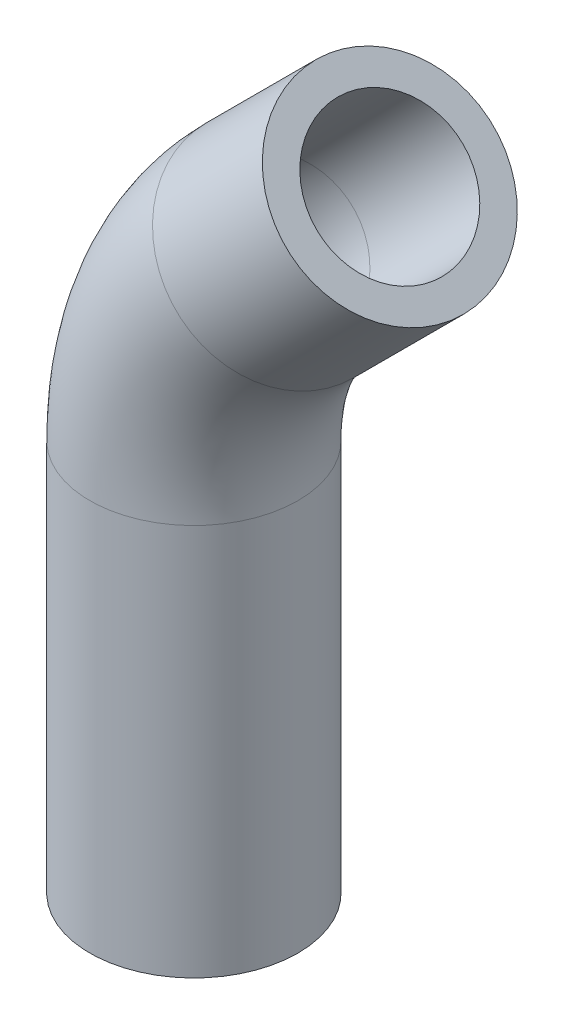
ISO-10303-21;
HEADER;
FILE_DESCRIPTION(('STEP AP214'),'2;1');
FILE_NAME('part.step','',(''),(''),'','','');
FILE_SCHEMA(('AUTOMOTIVE_DESIGN { 1 0 10303 214 1 1 1 1 }'));
ENDSEC;
DATA;
#1=APPLICATION_CONTEXT('core data for automotive mechanical design processes');
#2=APPLICATION_PROTOCOL_DEFINITION('international standard','automotive_design',2000,#1);
#3=PRODUCT_CONTEXT('',#1,'mechanical');
#4=PRODUCT('Part','Part','',(#3));
#5=PRODUCT_RELATED_PRODUCT_CATEGORY('part','',(#4));
#6=PRODUCT_DEFINITION_FORMATION('','',#4);
#7=PRODUCT_DEFINITION_CONTEXT('part definition',#1,'design');
#8=PRODUCT_DEFINITION('design','',#6,#7);
#9=PRODUCT_DEFINITION_SHAPE('','',#8);
#10=(LENGTH_UNIT() NAMED_UNIT(*) SI_UNIT(.MILLI.,.METRE.));
#11=(NAMED_UNIT(*) PLANE_ANGLE_UNIT() SI_UNIT($,.RADIAN.));
#12=(NAMED_UNIT(*) SI_UNIT($,.STERADIAN.) SOLID_ANGLE_UNIT());
#13=UNCERTAINTY_MEASURE_WITH_UNIT(LENGTH_MEASURE(1.E-05),#10,'distance_accuracy_value','');
#14=(GEOMETRIC_REPRESENTATION_CONTEXT(3) GLOBAL_UNCERTAINTY_ASSIGNED_CONTEXT((#13)) GLOBAL_UNIT_ASSIGNED_CONTEXT((#10,
#11,#12)) REPRESENTATION_CONTEXT('',''));
#15=CARTESIAN_POINT('',(0.,0.,0.));
#16=DIRECTION('',(0.,0.,1.));
#17=DIRECTION('',(1.,0.,0.));
#18=AXIS2_PLACEMENT_3D('',#15,#16,#17);
#19=CARTESIAN_POINT('',(0.,0.,0.));
#20=DIRECTION('',(0.,-1.,0.));
#21=DIRECTION('',(1.,0.,0.));
#22=AXIS2_PLACEMENT_3D('',#19,#20,#21);
#23=PLANE('',#22);
#24=CARTESIAN_POINT('',(0.,0.,0.));
#25=DIRECTION('',(0.,-1.,0.));
#26=DIRECTION('',(1.,0.,0.));
#27=AXIS2_PLACEMENT_3D('',#24,#25,#26);
#28=CIRCLE('',#27,9.525);
#29=CARTESIAN_POINT('',(9.52500000000001,0.,0.));
#30=VERTEX_POINT('',#29);
#31=EDGE_CURVE('E84',#30,#30,#28,.T.);
#32=ORIENTED_EDGE('',*,*,#31,.F.);
#33=EDGE_LOOP('',(#32));
#34=FACE_BOUND('',#33,.T.);
#35=CARTESIAN_POINT('',(0.,0.,0.));
#36=DIRECTION('',(0.,-1.,0.));
#37=DIRECTION('',(1.,0.,0.));
#38=AXIS2_PLACEMENT_3D('',#35,#36,#37);
#39=CIRCLE('',#38,13.49375);
#40=CARTESIAN_POINT('',(13.49375,0.,0.));
#41=VERTEX_POINT('',#40);
#42=EDGE_CURVE('E78',#41,#41,#39,.T.);
#43=ORIENTED_EDGE('',*,*,#42,.T.);
#44=EDGE_LOOP('',(#43));
#45=FACE_BOUND('',#44,.T.);
#46=ADVANCED_FACE('F61',(#34,#45),#23,.T.);
#47=CARTESIAN_POINT('',(25.4,91.9815367264148,0.));
#48=DIRECTION('',(-0.707106781186549,-0.707106781186546,0.));
#49=DIRECTION('',(0.707106781186546,-0.707106781186549,0.));
#50=AXIS2_PLACEMENT_3D('',#47,#48,#49);
#51=PLANE('',#50);
#52=CARTESIAN_POINT('',(25.4000000000001,91.9815367264147,0.));
#53=DIRECTION('',(-0.707106781186549,-0.707106781186546,0.));
#54=DIRECTION('',(0.707106781186546,-0.707106781186549,0.));
#55=AXIS2_PLACEMENT_3D('',#52,#53,#54);
#56=CIRCLE('',#55,9.525);
#57=CARTESIAN_POINT('',(32.1351920908019,85.2463446356128,0.));
#58=VERTEX_POINT('',#57);
#59=EDGE_CURVE('E88',#58,#58,#56,.T.);
#60=ORIENTED_EDGE('',*,*,#59,.T.);
#61=EDGE_LOOP('',(#60));
#62=FACE_BOUND('',#61,.T.);
#63=CARTESIAN_POINT('',(25.4,91.9815367264148,0.));
#64=DIRECTION('',(-0.707106781186549,-0.707106781186546,0.));
#65=DIRECTION('',(0.707106781186546,-0.707106781186549,0.));
#66=AXIS2_PLACEMENT_3D('',#63,#64,#65);
#67=CIRCLE('',#66,13.49375);
#68=CARTESIAN_POINT('',(34.941522128636,82.4400145977788,0.));
#69=VERTEX_POINT('',#68);
#70=EDGE_CURVE('E11',#69,#69,#67,.T.);
#71=ORIENTED_EDGE('',*,*,#70,.F.);
#72=EDGE_LOOP('',(#71));
#73=FACE_BOUND('',#72,.T.);
#74=ADVANCED_FACE('F101',(#62,#73),#51,.F.);
#75=CARTESIAN_POINT('',(0.,0.,0.));
#76=DIRECTION('',(0.,1.,0.));
#77=DIRECTION('',(0.,0.,1.));
#78=AXIS2_PLACEMENT_3D('',#75,#76,#77);
#79=CYLINDRICAL_SURFACE('',#78,13.49375);
#80=CARTESIAN_POINT('',(0.,50.8,0.));
#81=DIRECTION('',(0.,-1.,0.));
#82=DIRECTION('',(1.,0.,0.));
#83=AXIS2_PLACEMENT_3D('',#80,#81,#82);
#84=CIRCLE('',#83,13.49375);
#85=CARTESIAN_POINT('',(-13.49375,50.8,0.));
#86=VERTEX_POINT('',#85);
#87=EDGE_CURVE('E73',#86,#86,#84,.T.);
#88=ORIENTED_EDGE('',*,*,#87,.T.);
#89=EDGE_LOOP('',(#88));
#90=FACE_BOUND('',#89,.T.);
#91=ORIENTED_EDGE('',*,*,#42,.F.);
#92=EDGE_LOOP('',(#91));
#93=FACE_BOUND('',#92,.T.);
#94=ADVANCED_FACE('F127',(#90,#93),#79,.T.);
#95=CARTESIAN_POINT('',(38.1,50.8,0.));
#96=DIRECTION('',(0.,0.,-1.));
#97=DIRECTION('',(-1.,0.,0.));
#98=AXIS2_PLACEMENT_3D('',#95,#96,#97);
#99=TOROIDAL_SURFACE('',#98,38.1,13.49375);
#100=CARTESIAN_POINT('',(11.1592316367928,77.7407683632075,0.));
#101=DIRECTION('',(-0.707106781186549,-0.707106781186546,0.));
#102=DIRECTION('',(0.707106781186546,-0.707106781186549,0.));
#103=AXIS2_PLACEMENT_3D('',#100,#101,#102);
#104=CIRCLE('',#103,13.49375);
#105=CARTESIAN_POINT('',(1.61770950815671,87.2822904918436,0.));
#106=VERTEX_POINT('',#105);
#107=EDGE_CURVE('E68',#106,#106,#104,.T.);
#108=CARTESIAN_POINT('',(38.1,50.8,0.));
#109=DIRECTION('',(0.,0.,-1.));
#110=DIRECTION('',(-1.,0.,0.));
#111=AXIS2_PLACEMENT_3D('',#108,#109,#110);
#112=CIRCLE('',#111,51.59375);
#113=EDGE_CURVE('',#86,#106,#112,.T.);
#114=ORIENTED_EDGE('',*,*,#87,.F.);
#115=ORIENTED_EDGE('',*,*,#107,.T.);
#116=ORIENTED_EDGE('',*,*,#113,.T.);
#117=ORIENTED_EDGE('',*,*,#113,.F.);
#118=EDGE_LOOP('',(#114,#116,#115,#117));
#119=FACE_BOUND('',#118,.T.);
#120=ADVANCED_FACE('F129',(#119),#99,.T.);
#121=CARTESIAN_POINT('',(11.1592316367926,77.7407683632075,0.));
#122=DIRECTION('',(0.70710678118655,0.707106781186545,0.));
#123=DIRECTION('',(-0.707106781186545,0.70710678118655,0.));
#124=AXIS2_PLACEMENT_3D('',#121,#122,#123);
#125=CYLINDRICAL_SURFACE('',#124,13.49375);
#126=ORIENTED_EDGE('',*,*,#70,.T.);
#127=EDGE_LOOP('',(#126));
#128=FACE_BOUND('',#127,.T.);
#129=ORIENTED_EDGE('',*,*,#107,.F.);
#130=EDGE_LOOP('',(#129));
#131=FACE_BOUND('',#130,.T.);
#132=ADVANCED_FACE('F119',(#128,#131),#125,.T.);
#133=CARTESIAN_POINT('',(0.,-1.,0.));
#134=DIRECTION('',(0.,1.,0.));
#135=DIRECTION('',(0.,0.,1.));
#136=AXIS2_PLACEMENT_3D('',#133,#134,#135);
#137=CYLINDRICAL_SURFACE('',#136,9.525);
#138=CARTESIAN_POINT('',(0.,50.8,0.));
#139=DIRECTION('',(0.,-1.,0.));
#140=DIRECTION('',(1.,0.,0.));
#141=AXIS2_PLACEMENT_3D('',#138,#139,#140);
#142=CIRCLE('',#141,9.525);
#143=CARTESIAN_POINT('',(-9.52499999999999,50.8,0.));
#144=VERTEX_POINT('',#143);
#145=EDGE_CURVE('E89',#144,#144,#142,.T.);
#146=ORIENTED_EDGE('',*,*,#145,.F.);
#147=EDGE_LOOP('',(#146));
#148=FACE_BOUND('',#147,.T.);
#149=ORIENTED_EDGE('',*,*,#31,.T.);
#150=EDGE_LOOP('',(#149));
#151=FACE_BOUND('',#150,.T.);
#152=ADVANCED_FACE('F109',(#148,#151),#137,.F.);
#153=CARTESIAN_POINT('',(38.1,50.8,0.));
#154=DIRECTION('',(0.,0.,-1.));
#155=DIRECTION('',(-1.,0.,0.));
#156=AXIS2_PLACEMENT_3D('',#153,#154,#155);
#157=TOROIDAL_SURFACE('',#156,38.1,9.525);
#158=CARTESIAN_POINT('',(11.1592316367927,77.7407683632075,0.));
#159=DIRECTION('',(-0.707106781186549,-0.707106781186546,0.));
#160=DIRECTION('',(0.707106781186546,-0.707106781186549,0.));
#161=AXIS2_PLACEMENT_3D('',#158,#159,#160);
#162=CIRCLE('',#161,9.525);
#163=CARTESIAN_POINT('',(4.4240395459908,84.4759604540094,0.));
#164=VERTEX_POINT('',#163);
#165=EDGE_CURVE('E93',#164,#164,#162,.T.);
#166=CARTESIAN_POINT('',(38.1,50.8,0.));
#167=DIRECTION('',(0.,0.,-1.));
#168=DIRECTION('',(-1.,0.,0.));
#169=AXIS2_PLACEMENT_3D('',#166,#167,#168);
#170=CIRCLE('',#169,47.625);
#171=EDGE_CURVE('',#144,#164,#170,.T.);
#172=ORIENTED_EDGE('',*,*,#145,.T.);
#173=ORIENTED_EDGE('',*,*,#165,.F.);
#174=ORIENTED_EDGE('',*,*,#171,.T.);
#175=ORIENTED_EDGE('',*,*,#171,.F.);
#176=EDGE_LOOP('',(#172,#174,#173,#175));
#177=FACE_BOUND('',#176,.T.);
#178=ADVANCED_FACE('F107',(#177),#157,.F.);
#179=CARTESIAN_POINT('',(11.1592316367927,77.7407683632075,0.));
#180=DIRECTION('',(0.70710678118655,0.707106781186545,0.));
#181=DIRECTION('',(-0.707106781186545,0.70710678118655,0.));
#182=AXIS2_PLACEMENT_3D('',#179,#180,#181);
#183=CYLINDRICAL_SURFACE('',#182,9.525);
#184=ORIENTED_EDGE('',*,*,#59,.F.);
#185=EDGE_LOOP('',(#184));
#186=FACE_BOUND('',#185,.T.);
#187=ORIENTED_EDGE('',*,*,#165,.T.);
#188=EDGE_LOOP('',(#187));
#189=FACE_BOUND('',#188,.T.);
#190=ADVANCED_FACE('F104',(#186,#189),#183,.F.);
#191=CLOSED_SHELL('',(#46,#74,#94,#120,#132,#152,#178,#190));
#192=MANIFOLD_SOLID_BREP('B2',#191);
#193=ADVANCED_BREP_SHAPE_REPRESENTATION('',(#18,#192),#14);
#194=SHAPE_DEFINITION_REPRESENTATION(#9,#193);
ENDSEC;
END-ISO-10303-21;
